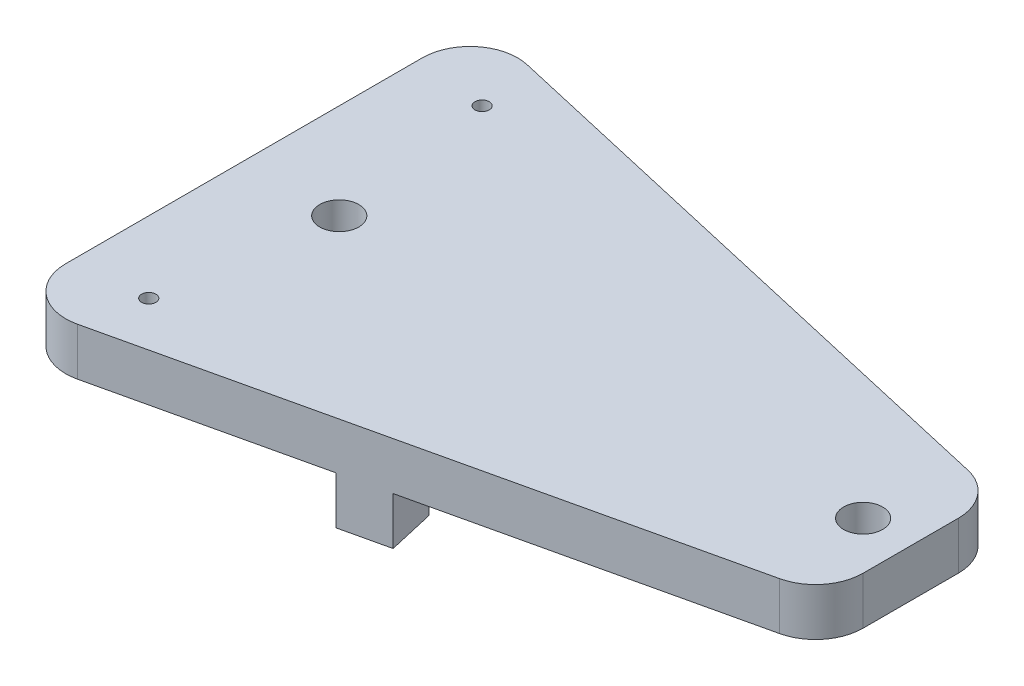
ISO-10303-21;
HEADER;
FILE_DESCRIPTION(('STEP AP214'),'2;1');
FILE_NAME('part.step','',(''),(''),'','','');
FILE_SCHEMA(('AUTOMOTIVE_DESIGN { 1 0 10303 214 1 1 1 1 }'));
ENDSEC;
DATA;
#1=APPLICATION_CONTEXT('core data for automotive mechanical design processes');
#2=APPLICATION_PROTOCOL_DEFINITION('international standard','automotive_design',2000,#1);
#3=PRODUCT_CONTEXT('',#1,'mechanical');
#4=PRODUCT('Part','Part','',(#3));
#5=PRODUCT_RELATED_PRODUCT_CATEGORY('part','',(#4));
#6=PRODUCT_DEFINITION_FORMATION('','',#4);
#7=PRODUCT_DEFINITION_CONTEXT('part definition',#1,'design');
#8=PRODUCT_DEFINITION('design','',#6,#7);
#9=PRODUCT_DEFINITION_SHAPE('','',#8);
#10=(LENGTH_UNIT() NAMED_UNIT(*) SI_UNIT(.MILLI.,.METRE.));
#11=(NAMED_UNIT(*) PLANE_ANGLE_UNIT() SI_UNIT($,.RADIAN.));
#12=(NAMED_UNIT(*) SI_UNIT($,.STERADIAN.) SOLID_ANGLE_UNIT());
#13=UNCERTAINTY_MEASURE_WITH_UNIT(LENGTH_MEASURE(1.E-05),#10,'distance_accuracy_value','');
#14=(GEOMETRIC_REPRESENTATION_CONTEXT(3) GLOBAL_UNCERTAINTY_ASSIGNED_CONTEXT((#13)) GLOBAL_UNIT_ASSIGNED_CONTEXT((#10,
#11,#12)) REPRESENTATION_CONTEXT('',''));
#15=CARTESIAN_POINT('',(0.,0.,0.));
#16=DIRECTION('',(0.,0.,1.));
#17=DIRECTION('',(1.,0.,0.));
#18=AXIS2_PLACEMENT_3D('',#15,#16,#17);
#19=CARTESIAN_POINT('',(27.0142215577712,0.,-10.));
#20=DIRECTION('',(0.,-1.,0.));
#21=DIRECTION('',(0.,0.,-1.));
#22=AXIS2_PLACEMENT_3D('',#19,#20,#21);
#23=PLANE('',#22);
#24=DIRECTION('',(0.,0.,1.));
#25=VECTOR('',#24,1.);
#26=CARTESIAN_POINT('',(-82.8857784422288,0.,29.9));
#27=LINE('',#26,#25);
#28=CARTESIAN_POINT('',(-82.8857784422288,0.,29.9));
#29=VERTEX_POINT('',#28);
#30=CARTESIAN_POINT('',(-82.8857784422288,0.,40.1));
#31=VERTEX_POINT('',#30);
#32=EDGE_CURVE('E264',#29,#31,#27,.T.);
#33=ORIENTED_EDGE('',*,*,#32,.F.);
#34=DIRECTION('',(1.,0.,0.));
#35=VECTOR('',#34,1.);
#36=CARTESIAN_POINT('',(-93.0857784422288,0.,29.9));
#37=LINE('',#36,#35);
#38=CARTESIAN_POINT('',(-93.0857784422288,0.,29.9));
#39=VERTEX_POINT('',#38);
#40=EDGE_CURVE('E254',#39,#29,#37,.T.);
#41=ORIENTED_EDGE('',*,*,#40,.F.);
#42=DIRECTION('',(0.,0.,-1.));
#43=VECTOR('',#42,1.);
#44=CARTESIAN_POINT('',(-93.0857784422288,0.,29.9));
#45=LINE('',#44,#43);
#46=CARTESIAN_POINT('',(-93.0857784422288,0.,40.1));
#47=VERTEX_POINT('',#46);
#48=EDGE_CURVE('E270',#47,#39,#45,.T.);
#49=ORIENTED_EDGE('',*,*,#48,.F.);
#50=DIRECTION('',(-1.,0.,0.));
#51=VECTOR('',#50,1.);
#52=CARTESIAN_POINT('',(-93.0857784422288,0.,40.1));
#53=LINE('',#52,#51);
#54=EDGE_CURVE('E266',#31,#47,#53,.T.);
#55=ORIENTED_EDGE('',*,*,#54,.F.);
#56=EDGE_LOOP('',(#33,#41,#49,#55));
#57=FACE_BOUND('',#56,.T.);
#58=DIRECTION('',(0.,0.,1.));
#59=VECTOR('',#58,1.);
#60=CARTESIAN_POINT('',(-82.8857784422288,0.,-40.1));
#61=LINE('',#60,#59);
#62=CARTESIAN_POINT('',(-82.8857784422288,0.,-40.1));
#63=VERTEX_POINT('',#62);
#64=CARTESIAN_POINT('',(-82.8857784422288,0.,-29.9));
#65=VERTEX_POINT('',#64);
#66=EDGE_CURVE('E249',#63,#65,#61,.T.);
#67=ORIENTED_EDGE('',*,*,#66,.F.);
#68=DIRECTION('',(1.,0.,0.));
#69=VECTOR('',#68,1.);
#70=CARTESIAN_POINT('',(-93.0857784422288,0.,-40.1));
#71=LINE('',#70,#69);
#72=CARTESIAN_POINT('',(-93.0857784422288,0.,-40.1));
#73=VERTEX_POINT('',#72);
#74=EDGE_CURVE('E288',#73,#63,#71,.T.);
#75=ORIENTED_EDGE('',*,*,#74,.F.);
#76=DIRECTION('',(0.,0.,-1.));
#77=VECTOR('',#76,1.);
#78=CARTESIAN_POINT('',(-93.0857784422288,0.,-40.1));
#79=LINE('',#78,#77);
#80=CARTESIAN_POINT('',(-93.0857784422288,0.,-29.9));
#81=VERTEX_POINT('',#80);
#82=EDGE_CURVE('E302',#81,#73,#79,.T.);
#83=ORIENTED_EDGE('',*,*,#82,.F.);
#84=DIRECTION('',(-1.,0.,0.));
#85=VECTOR('',#84,1.);
#86=CARTESIAN_POINT('',(-93.0857784422288,0.,-29.9));
#87=LINE('',#86,#85);
#88=EDGE_CURVE('E299',#65,#81,#87,.T.);
#89=ORIENTED_EDGE('',*,*,#88,.F.);
#90=EDGE_LOOP('',(#67,#75,#83,#89));
#91=FACE_BOUND('',#90,.T.);
#92=CARTESIAN_POINT('',(-82.9857784422288,0.,0.));
#93=DIRECTION('',(0.,1.,0.));
#94=DIRECTION('',(0.,0.,1.));
#95=AXIS2_PLACEMENT_3D('',#92,#93,#94);
#96=CIRCLE('',#95,4.1);
#97=CARTESIAN_POINT('',(-82.9857784422288,0.,4.1));
#98=VERTEX_POINT('',#97);
#99=EDGE_CURVE('E324',#98,#98,#96,.T.);
#100=ORIENTED_EDGE('',*,*,#99,.T.);
#101=EDGE_LOOP('',(#100));
#102=FACE_BOUND('',#101,.T.);
#103=CARTESIAN_POINT('',(27.0142215577712,0.,0.));
#104=DIRECTION('',(0.,1.,0.));
#105=DIRECTION('',(0.,0.,1.));
#106=AXIS2_PLACEMENT_3D('',#103,#104,#105);
#107=CIRCLE('',#106,4.1);
#108=CARTESIAN_POINT('',(27.0142215577712,0.,4.1));
#109=VERTEX_POINT('',#108);
#110=EDGE_CURVE('E320',#109,#109,#107,.T.);
#111=ORIENTED_EDGE('',*,*,#110,.T.);
#112=EDGE_LOOP('',(#111));
#113=FACE_BOUND('',#112,.T.);
#114=DIRECTION('',(-0.974813943574362,0.,-0.223019674945958));
#115=VECTOR('',#114,1.);
#116=CARTESIAN_POINT('',(-90.7555816927692,0.,-47.2019537455647));
#117=LINE('',#116,#115);
#118=CARTESIAN_POINT('',(-46.5666702904307,0.,-37.0923356772902));
#119=VERTEX_POINT('',#118);
#120=CARTESIAN_POINT('',(-90.7555816927692,0.,-47.2019537455647));
#121=VERTEX_POINT('',#120);
#122=EDGE_CURVE('E354',#119,#121,#117,.T.);
#123=ORIENTED_EDGE('',*,*,#122,.F.);
#124=DIRECTION('',(0.223019674945958,0.,-0.974813943574362));
#125=VECTOR('',#124,1.);
#126=CARTESIAN_POINT('',(-48.7968670398903,0.,-27.3441962415466));
#127=LINE('',#126,#125);
#128=CARTESIAN_POINT('',(-48.7968670398903,0.,-27.3441962415466));
#129=VERTEX_POINT('',#128);
#130=EDGE_CURVE('E50',#129,#119,#127,.T.);
#131=ORIENTED_EDGE('',*,*,#130,.F.);
#132=DIRECTION('',(-0.974813943574362,0.,-0.223019674945958));
#133=VECTOR('',#132,1.);
#134=CARTESIAN_POINT('',(-39.0487276041467,0.,-25.113999492087));
#135=LINE('',#134,#133);
#136=CARTESIAN_POINT('',(-39.0487276041467,0.,-25.113999492087));
#137=VERTEX_POINT('',#136);
#138=EDGE_CURVE('E214',#137,#129,#135,.T.);
#139=ORIENTED_EDGE('',*,*,#138,.F.);
#140=DIRECTION('',(-0.223019674945957,0.,0.974813943574362));
#141=VECTOR('',#140,1.);
#142=CARTESIAN_POINT('',(-36.8185308546871,0.,-34.8621389278306));
#143=LINE('',#142,#141);
#144=CARTESIAN_POINT('',(-36.8185308546871,0.,-34.8621389278306));
#145=VERTEX_POINT('',#144);
#146=EDGE_CURVE('E470',#145,#137,#143,.T.);
#147=ORIENTED_EDGE('',*,*,#146,.F.);
#148=CARTESIAN_POINT('',(29.2444183072308,0.,-19.7481394357436));
#149=VERTEX_POINT('',#148);
#150=EDGE_CURVE('E355',#149,#145,#117,.T.);
#151=ORIENTED_EDGE('',*,*,#150,.F.);
#152=CARTESIAN_POINT('',(27.0142215577712,0.,-10.));
#153=DIRECTION('',(0.,1.,0.));
#154=DIRECTION('',(0.,0.,-1.));
#155=AXIS2_PLACEMENT_3D('',#152,#153,#154);
#156=CIRCLE('',#155,9.99999999999999);
#157=CARTESIAN_POINT('',(37.0142215577712,0.,-10.));
#158=VERTEX_POINT('',#157);
#159=EDGE_CURVE('E330',#158,#149,#156,.T.);
#160=ORIENTED_EDGE('',*,*,#159,.F.);
#161=DIRECTION('',(0.,0.,-1.));
#162=VECTOR('',#161,1.);
#163=CARTESIAN_POINT('',(37.0142215577712,0.,10.));
#164=LINE('',#163,#162);
#165=CARTESIAN_POINT('',(37.0142215577712,0.,10.));
#166=VERTEX_POINT('',#165);
#167=EDGE_CURVE('E337',#166,#158,#164,.T.);
#168=ORIENTED_EDGE('',*,*,#167,.F.);
#169=CARTESIAN_POINT('',(27.0142215577712,0.,10.));
#170=DIRECTION('',(0.,1.,0.));
#171=DIRECTION('',(0.,0.,1.));
#172=AXIS2_PLACEMENT_3D('',#169,#170,#171);
#173=CIRCLE('',#172,9.99999999999999);
#174=CARTESIAN_POINT('',(29.2444183072308,0.,19.7481394357436));
#175=VERTEX_POINT('',#174);
#176=EDGE_CURVE('E367',#175,#166,#173,.T.);
#177=ORIENTED_EDGE('',*,*,#176,.F.);
#178=DIRECTION('',(0.974813943574362,0.,-0.223019674945958));
#179=VECTOR('',#178,1.);
#180=CARTESIAN_POINT('',(-90.7555816927692,0.,47.2019537455647));
#181=LINE('',#180,#179);
#182=CARTESIAN_POINT('',(-36.8185308546871,0.,34.8621389278306));
#183=VERTEX_POINT('',#182);
#184=EDGE_CURVE('E363',#183,#175,#181,.T.);
#185=ORIENTED_EDGE('',*,*,#184,.F.);
#186=DIRECTION('',(0.223019674945959,0.,0.974813943574362));
#187=VECTOR('',#186,1.);
#188=CARTESIAN_POINT('',(-36.8185308546871,0.,34.8621389278306));
#189=LINE('',#188,#187);
#190=CARTESIAN_POINT('',(-39.0487276041467,0.,25.113999492087));
#191=VERTEX_POINT('',#190);
#192=EDGE_CURVE('E229',#191,#183,#189,.T.);
#193=ORIENTED_EDGE('',*,*,#192,.F.);
#194=DIRECTION('',(0.974813943574362,0.,-0.223019674945958));
#195=VECTOR('',#194,1.);
#196=CARTESIAN_POINT('',(-39.0487276041467,0.,25.113999492087));
#197=LINE('',#196,#195);
#198=CARTESIAN_POINT('',(-48.7968670398903,0.,27.3441962415466));
#199=VERTEX_POINT('',#198);
#200=EDGE_CURVE('E58',#199,#191,#197,.T.);
#201=ORIENTED_EDGE('',*,*,#200,.F.);
#202=DIRECTION('',(-0.223019674945957,0.,-0.974813943574362));
#203=VECTOR('',#202,1.);
#204=CARTESIAN_POINT('',(-48.7968670398903,0.,27.3441962415466));
#205=LINE('',#204,#203);
#206=CARTESIAN_POINT('',(-46.5666702904307,0.,37.0923356772902));
#207=VERTEX_POINT('',#206);
#208=EDGE_CURVE('E217',#207,#199,#205,.T.);
#209=ORIENTED_EDGE('',*,*,#208,.F.);
#210=CARTESIAN_POINT('',(-90.7555816927692,0.,47.2019537455647));
#211=VERTEX_POINT('',#210);
#212=EDGE_CURVE('E364',#211,#207,#181,.T.);
#213=ORIENTED_EDGE('',*,*,#212,.F.);
#214=CARTESIAN_POINT('',(-92.9857784422288,0.,37.453814309821));
#215=DIRECTION('',(0.,1.,0.));
#216=DIRECTION('',(0.,0.,-1.));
#217=AXIS2_PLACEMENT_3D('',#214,#215,#216);
#218=CIRCLE('',#217,10.);
#219=CARTESIAN_POINT('',(-102.985778442229,0.,37.453814309821));
#220=VERTEX_POINT('',#219);
#221=EDGE_CURVE('E361',#220,#211,#218,.T.);
#222=ORIENTED_EDGE('',*,*,#221,.F.);
#223=DIRECTION('',(0.,0.,1.));
#224=VECTOR('',#223,1.);
#225=CARTESIAN_POINT('',(-102.985778442229,0.,37.453814309821));
#226=LINE('',#225,#224);
#227=CARTESIAN_POINT('',(-102.985778442229,0.,-37.453814309821));
#228=VERTEX_POINT('',#227);
#229=EDGE_CURVE('E359',#228,#220,#226,.T.);
#230=ORIENTED_EDGE('',*,*,#229,.F.);
#231=CARTESIAN_POINT('',(-92.9857784422288,0.,-37.453814309821));
#232=DIRECTION('',(0.,1.,0.));
#233=DIRECTION('',(0.,0.,-1.));
#234=AXIS2_PLACEMENT_3D('',#231,#232,#233);
#235=CIRCLE('',#234,10.);
#236=EDGE_CURVE('E357',#121,#228,#235,.T.);
#237=ORIENTED_EDGE('',*,*,#236,.F.);
#238=EDGE_LOOP('',(#123,#131,#139,#147,#151,#160,#168,#177,#185,#193,#201,#209,#213,#222,#230,#237));
#239=FACE_BOUND('',#238,.T.);
#240=ADVANCED_FACE('F33',(#57,#91,#102,#113,#239),#23,.T.);
#241=CARTESIAN_POINT('',(27.0142215577712,10.,-10.));
#242=DIRECTION('',(0.,-1.,0.));
#243=DIRECTION('',(0.,0.,-1.));
#244=AXIS2_PLACEMENT_3D('',#241,#242,#243);
#245=PLANE('',#244);
#246=CARTESIAN_POINT('',(27.0142215577712,10.,-10.));
#247=DIRECTION('',(0.,1.,0.));
#248=DIRECTION('',(0.,0.,-1.));
#249=AXIS2_PLACEMENT_3D('',#246,#247,#248);
#250=CIRCLE('',#249,9.99999999999999);
#251=CARTESIAN_POINT('',(37.0142215577712,10.,-10.));
#252=VERTEX_POINT('',#251);
#253=CARTESIAN_POINT('',(29.2444183072308,10.,-19.7481394357436));
#254=VERTEX_POINT('',#253);
#255=EDGE_CURVE('E333',#252,#254,#250,.T.);
#256=ORIENTED_EDGE('',*,*,#255,.T.);
#257=DIRECTION('',(-0.974813943574362,0.,-0.223019674945958));
#258=VECTOR('',#257,1.);
#259=CARTESIAN_POINT('',(-90.7555816927692,10.,-47.2019537455647));
#260=LINE('',#259,#258);
#261=CARTESIAN_POINT('',(-90.7555816927692,10.,-47.2019537455647));
#262=VERTEX_POINT('',#261);
#263=EDGE_CURVE('E336',#254,#262,#260,.T.);
#264=ORIENTED_EDGE('',*,*,#263,.T.);
#265=CARTESIAN_POINT('',(-92.9857784422288,10.,-37.453814309821));
#266=DIRECTION('',(0.,1.,0.));
#267=DIRECTION('',(0.,0.,-1.));
#268=AXIS2_PLACEMENT_3D('',#265,#266,#267);
#269=CIRCLE('',#268,10.);
#270=CARTESIAN_POINT('',(-102.985778442229,10.,-37.453814309821));
#271=VERTEX_POINT('',#270);
#272=EDGE_CURVE('E339',#262,#271,#269,.T.);
#273=ORIENTED_EDGE('',*,*,#272,.T.);
#274=DIRECTION('',(0.,0.,1.));
#275=VECTOR('',#274,1.);
#276=CARTESIAN_POINT('',(-102.985778442229,10.,37.453814309821));
#277=LINE('',#276,#275);
#278=CARTESIAN_POINT('',(-102.985778442229,10.,37.453814309821));
#279=VERTEX_POINT('',#278);
#280=EDGE_CURVE('E341',#271,#279,#277,.T.);
#281=ORIENTED_EDGE('',*,*,#280,.T.);
#282=CARTESIAN_POINT('',(-92.9857784422288,10.,37.453814309821));
#283=DIRECTION('',(0.,1.,0.));
#284=DIRECTION('',(0.,0.,-1.));
#285=AXIS2_PLACEMENT_3D('',#282,#283,#284);
#286=CIRCLE('',#285,10.);
#287=CARTESIAN_POINT('',(-90.7555816927692,10.,47.2019537455647));
#288=VERTEX_POINT('',#287);
#289=EDGE_CURVE('E343',#279,#288,#286,.T.);
#290=ORIENTED_EDGE('',*,*,#289,.T.);
#291=DIRECTION('',(0.974813943574362,0.,-0.223019674945958));
#292=VECTOR('',#291,1.);
#293=CARTESIAN_POINT('',(-90.7555816927692,10.,47.2019537455647));
#294=LINE('',#293,#292);
#295=CARTESIAN_POINT('',(29.2444183072308,10.,19.7481394357436));
#296=VERTEX_POINT('',#295);
#297=EDGE_CURVE('E345',#288,#296,#294,.T.);
#298=ORIENTED_EDGE('',*,*,#297,.T.);
#299=CARTESIAN_POINT('',(27.0142215577712,10.,10.));
#300=DIRECTION('',(0.,1.,0.));
#301=DIRECTION('',(0.,0.,1.));
#302=AXIS2_PLACEMENT_3D('',#299,#300,#301);
#303=CIRCLE('',#302,9.99999999999999);
#304=CARTESIAN_POINT('',(37.0142215577712,10.,10.));
#305=VERTEX_POINT('',#304);
#306=EDGE_CURVE('E347',#296,#305,#303,.T.);
#307=ORIENTED_EDGE('',*,*,#306,.T.);
#308=DIRECTION('',(0.,0.,-1.));
#309=VECTOR('',#308,1.);
#310=CARTESIAN_POINT('',(37.0142215577712,10.,10.));
#311=LINE('',#310,#309);
#312=EDGE_CURVE('E349',#305,#252,#311,.T.);
#313=ORIENTED_EDGE('',*,*,#312,.T.);
#314=EDGE_LOOP('',(#256,#264,#273,#281,#290,#298,#307,#313));
#315=FACE_BOUND('',#314,.T.);
#316=CARTESIAN_POINT('',(-82.9857784422288,10.,0.));
#317=DIRECTION('',(0.,1.,0.));
#318=DIRECTION('',(0.,0.,1.));
#319=AXIS2_PLACEMENT_3D('',#316,#317,#318);
#320=CIRCLE('',#319,4.1);
#321=CARTESIAN_POINT('',(-82.9857784422288,10.,4.1));
#322=VERTEX_POINT('',#321);
#323=EDGE_CURVE('E327',#322,#322,#320,.T.);
#324=ORIENTED_EDGE('',*,*,#323,.F.);
#325=EDGE_LOOP('',(#324));
#326=FACE_BOUND('',#325,.T.);
#327=CARTESIAN_POINT('',(27.0142215577712,10.,0.));
#328=DIRECTION('',(0.,1.,0.));
#329=DIRECTION('',(0.,0.,1.));
#330=AXIS2_PLACEMENT_3D('',#327,#328,#329);
#331=CIRCLE('',#330,4.1);
#332=CARTESIAN_POINT('',(27.0142215577712,10.,4.1));
#333=VERTEX_POINT('',#332);
#334=EDGE_CURVE('E321',#333,#333,#331,.T.);
#335=ORIENTED_EDGE('',*,*,#334,.F.);
#336=EDGE_LOOP('',(#335));
#337=FACE_BOUND('',#336,.T.);
#338=CARTESIAN_POINT('',(-87.9857784422288,10.,35.));
#339=DIRECTION('',(0.,1.,0.));
#340=DIRECTION('',(0.,0.,1.));
#341=AXIS2_PLACEMENT_3D('',#338,#339,#340);
#342=CIRCLE('',#341,1.5);
#343=CARTESIAN_POINT('',(-87.9857784422288,10.,36.5));
#344=VERTEX_POINT('',#343);
#345=EDGE_CURVE('E317',#344,#344,#342,.T.);
#346=ORIENTED_EDGE('',*,*,#345,.F.);
#347=EDGE_LOOP('',(#346));
#348=FACE_BOUND('',#347,.T.);
#349=CARTESIAN_POINT('',(-87.9857784422288,10.,-35.));
#350=DIRECTION('',(0.,1.,0.));
#351=DIRECTION('',(0.,0.,1.));
#352=AXIS2_PLACEMENT_3D('',#349,#350,#351);
#353=CIRCLE('',#352,1.5);
#354=CARTESIAN_POINT('',(-87.9857784422288,10.,-33.5));
#355=VERTEX_POINT('',#354);
#356=EDGE_CURVE('E314',#355,#355,#353,.T.);
#357=ORIENTED_EDGE('',*,*,#356,.F.);
#358=EDGE_LOOP('',(#357));
#359=FACE_BOUND('',#358,.T.);
#360=ADVANCED_FACE('F405',(#315,#326,#337,#348,#359),#245,.F.);
#361=CARTESIAN_POINT('',(27.0142215577712,10.,-10.));
#362=DIRECTION('',(0.,-1.,0.));
#363=DIRECTION('',(0.,0.,-1.));
#364=AXIS2_PLACEMENT_3D('',#361,#362,#363);
#365=CYLINDRICAL_SURFACE('',#364,9.99999999999999);
#366=ORIENTED_EDGE('',*,*,#159,.T.);
#367=DIRECTION('',(0.,-1.,0.));
#368=VECTOR('',#367,1.);
#369=CARTESIAN_POINT('',(29.2444183072308,10.,-19.7481394357436));
#370=LINE('',#369,#368);
#371=EDGE_CURVE('E11',#254,#149,#370,.T.);
#372=ORIENTED_EDGE('',*,*,#371,.F.);
#373=ORIENTED_EDGE('',*,*,#255,.F.);
#374=DIRECTION('',(0.,-1.,0.));
#375=VECTOR('',#374,1.);
#376=CARTESIAN_POINT('',(37.0142215577712,10.,-10.));
#377=LINE('',#376,#375);
#378=EDGE_CURVE('E351',#252,#158,#377,.T.);
#379=ORIENTED_EDGE('',*,*,#378,.T.);
#380=EDGE_LOOP('',(#366,#372,#373,#379));
#381=FACE_BOUND('',#380,.T.);
#382=ADVANCED_FACE('F35',(#381),#365,.T.);
#383=CARTESIAN_POINT('',(-90.7555816927692,10.,-47.2019537455647));
#384=DIRECTION('',(-0.223019674945958,0.,0.974813943574362));
#385=DIRECTION('',(0.974813943574362,0.,0.223019674945958));
#386=AXIS2_PLACEMENT_3D('',#383,#384,#385);
#387=PLANE('',#386);
#388=ORIENTED_EDGE('',*,*,#150,.T.);
#389=DIRECTION('',(0.,1.,0.));
#390=VECTOR('',#389,1.);
#391=CARTESIAN_POINT('',(-36.8185308546871,-10.,-34.8621389278306));
#392=LINE('',#391,#390);
#393=CARTESIAN_POINT('',(-36.8185308546871,-10.,-34.8621389278306));
#394=VERTEX_POINT('',#393);
#395=EDGE_CURVE('E203',#394,#145,#392,.T.);
#396=ORIENTED_EDGE('',*,*,#395,.F.);
#397=DIRECTION('',(0.974813943574362,0.,0.223019674945958));
#398=VECTOR('',#397,1.);
#399=CARTESIAN_POINT('',(-46.5666702904307,-10.,-37.0923356772902));
#400=LINE('',#399,#398);
#401=CARTESIAN_POINT('',(-46.5666702904307,-10.,-37.0923356772902));
#402=VERTEX_POINT('',#401);
#403=EDGE_CURVE('E197',#402,#394,#400,.T.);
#404=ORIENTED_EDGE('',*,*,#403,.F.);
#405=DIRECTION('',(0.,1.,0.));
#406=VECTOR('',#405,1.);
#407=CARTESIAN_POINT('',(-46.5666702904307,-10.,-37.0923356772902));
#408=LINE('',#407,#406);
#409=EDGE_CURVE('E201',#402,#119,#408,.T.);
#410=ORIENTED_EDGE('',*,*,#409,.T.);
#411=ORIENTED_EDGE('',*,*,#122,.T.);
#412=DIRECTION('',(0.,-1.,0.));
#413=VECTOR('',#412,1.);
#414=CARTESIAN_POINT('',(-90.7555816927692,10.,-47.2019537455647));
#415=LINE('',#414,#413);
#416=EDGE_CURVE('E42',#262,#121,#415,.T.);
#417=ORIENTED_EDGE('',*,*,#416,.F.);
#418=ORIENTED_EDGE('',*,*,#263,.F.);
#419=ORIENTED_EDGE('',*,*,#371,.T.);
#420=EDGE_LOOP('',(#388,#396,#404,#410,#411,#417,#418,#419));
#421=FACE_BOUND('',#420,.T.);
#422=ADVANCED_FACE('F200',(#421),#387,.F.);
#423=CARTESIAN_POINT('',(-92.9857784422288,10.,-37.453814309821));
#424=DIRECTION('',(0.,-1.,0.));
#425=DIRECTION('',(0.,0.,-1.));
#426=AXIS2_PLACEMENT_3D('',#423,#424,#425);
#427=CYLINDRICAL_SURFACE('',#426,10.);
#428=ORIENTED_EDGE('',*,*,#236,.T.);
#429=DIRECTION('',(0.,-1.,0.));
#430=VECTOR('',#429,1.);
#431=CARTESIAN_POINT('',(-102.985778442229,10.,-37.453814309821));
#432=LINE('',#431,#430);
#433=EDGE_CURVE('E384',#271,#228,#432,.T.);
#434=ORIENTED_EDGE('',*,*,#433,.F.);
#435=ORIENTED_EDGE('',*,*,#272,.F.);
#436=ORIENTED_EDGE('',*,*,#416,.T.);
#437=EDGE_LOOP('',(#428,#434,#435,#436));
#438=FACE_BOUND('',#437,.T.);
#439=ADVANCED_FACE('F451',(#438),#427,.T.);
#440=CARTESIAN_POINT('',(-102.985778442229,10.,37.453814309821));
#441=DIRECTION('',(1.,0.,0.));
#442=DIRECTION('',(0.,0.,-1.));
#443=AXIS2_PLACEMENT_3D('',#440,#441,#442);
#444=PLANE('',#443);
#445=ORIENTED_EDGE('',*,*,#229,.T.);
#446=DIRECTION('',(0.,-1.,0.));
#447=VECTOR('',#446,1.);
#448=CARTESIAN_POINT('',(-102.985778442229,10.,37.453814309821));
#449=LINE('',#448,#447);
#450=EDGE_CURVE('E381',#279,#220,#449,.T.);
#451=ORIENTED_EDGE('',*,*,#450,.F.);
#452=ORIENTED_EDGE('',*,*,#280,.F.);
#453=ORIENTED_EDGE('',*,*,#433,.T.);
#454=EDGE_LOOP('',(#445,#451,#452,#453));
#455=FACE_BOUND('',#454,.T.);
#456=ADVANCED_FACE('F447',(#455),#444,.F.);
#457=CARTESIAN_POINT('',(-92.9857784422288,10.,37.453814309821));
#458=DIRECTION('',(0.,-1.,0.));
#459=DIRECTION('',(0.,0.,-1.));
#460=AXIS2_PLACEMENT_3D('',#457,#458,#459);
#461=CYLINDRICAL_SURFACE('',#460,10.);
#462=ORIENTED_EDGE('',*,*,#221,.T.);
#463=DIRECTION('',(0.,-1.,0.));
#464=VECTOR('',#463,1.);
#465=CARTESIAN_POINT('',(-90.7555816927692,10.,47.2019537455647));
#466=LINE('',#465,#464);
#467=EDGE_CURVE('E378',#288,#211,#466,.T.);
#468=ORIENTED_EDGE('',*,*,#467,.F.);
#469=ORIENTED_EDGE('',*,*,#289,.F.);
#470=ORIENTED_EDGE('',*,*,#450,.T.);
#471=EDGE_LOOP('',(#462,#468,#469,#470));
#472=FACE_BOUND('',#471,.T.);
#473=ADVANCED_FACE('F443',(#472),#461,.T.);
#474=CARTESIAN_POINT('',(-90.7555816927692,10.,47.2019537455647));
#475=DIRECTION('',(-0.223019674945958,0.,-0.974813943574362));
#476=DIRECTION('',(-0.974813943574362,0.,0.223019674945958));
#477=AXIS2_PLACEMENT_3D('',#474,#475,#476);
#478=PLANE('',#477);
#479=ORIENTED_EDGE('',*,*,#212,.T.);
#480=DIRECTION('',(0.,1.,0.));
#481=VECTOR('',#480,1.);
#482=CARTESIAN_POINT('',(-46.5666702904307,-10.,37.0923356772902));
#483=LINE('',#482,#481);
#484=CARTESIAN_POINT('',(-46.5666702904307,-10.,37.0923356772902));
#485=VERTEX_POINT('',#484);
#486=EDGE_CURVE('E234',#485,#207,#483,.T.);
#487=ORIENTED_EDGE('',*,*,#486,.F.);
#488=DIRECTION('',(-0.974813943574362,0.,0.223019674945957));
#489=VECTOR('',#488,1.);
#490=CARTESIAN_POINT('',(-46.5666702904307,-10.,37.0923356772902));
#491=LINE('',#490,#489);
#492=CARTESIAN_POINT('',(-36.8185308546871,-10.,34.8621389278306));
#493=VERTEX_POINT('',#492);
#494=EDGE_CURVE('E233',#493,#485,#491,.T.);
#495=ORIENTED_EDGE('',*,*,#494,.F.);
#496=DIRECTION('',(0.,1.,0.));
#497=VECTOR('',#496,1.);
#498=CARTESIAN_POINT('',(-36.8185308546871,-10.,34.8621389278306));
#499=LINE('',#498,#497);
#500=EDGE_CURVE('E241',#493,#183,#499,.T.);
#501=ORIENTED_EDGE('',*,*,#500,.T.);
#502=ORIENTED_EDGE('',*,*,#184,.T.);
#503=DIRECTION('',(0.,-1.,0.));
#504=VECTOR('',#503,1.);
#505=CARTESIAN_POINT('',(29.2444183072308,10.,19.7481394357436));
#506=LINE('',#505,#504);
#507=EDGE_CURVE('E375',#296,#175,#506,.T.);
#508=ORIENTED_EDGE('',*,*,#507,.F.);
#509=ORIENTED_EDGE('',*,*,#297,.F.);
#510=ORIENTED_EDGE('',*,*,#467,.T.);
#511=EDGE_LOOP('',(#479,#487,#495,#501,#502,#508,#509,#510));
#512=FACE_BOUND('',#511,.T.);
#513=ADVANCED_FACE('F439',(#512),#478,.F.);
#514=CARTESIAN_POINT('',(27.0142215577712,10.,10.));
#515=DIRECTION('',(0.,-1.,0.));
#516=DIRECTION('',(0.,0.,-1.));
#517=AXIS2_PLACEMENT_3D('',#514,#515,#516);
#518=CYLINDRICAL_SURFACE('',#517,9.99999999999999);
#519=ORIENTED_EDGE('',*,*,#176,.T.);
#520=DIRECTION('',(0.,-1.,0.));
#521=VECTOR('',#520,1.);
#522=CARTESIAN_POINT('',(37.0142215577712,10.,10.));
#523=LINE('',#522,#521);
#524=EDGE_CURVE('E372',#305,#166,#523,.T.);
#525=ORIENTED_EDGE('',*,*,#524,.F.);
#526=ORIENTED_EDGE('',*,*,#306,.F.);
#527=ORIENTED_EDGE('',*,*,#507,.T.);
#528=EDGE_LOOP('',(#519,#525,#526,#527));
#529=FACE_BOUND('',#528,.T.);
#530=ADVANCED_FACE('F435',(#529),#518,.T.);
#531=CARTESIAN_POINT('',(37.0142215577712,10.,10.));
#532=DIRECTION('',(-1.,0.,0.));
#533=DIRECTION('',(0.,0.,1.));
#534=AXIS2_PLACEMENT_3D('',#531,#532,#533);
#535=PLANE('',#534);
#536=ORIENTED_EDGE('',*,*,#167,.T.);
#537=ORIENTED_EDGE('',*,*,#378,.F.);
#538=ORIENTED_EDGE('',*,*,#312,.F.);
#539=ORIENTED_EDGE('',*,*,#524,.T.);
#540=EDGE_LOOP('',(#536,#537,#538,#539));
#541=FACE_BOUND('',#540,.T.);
#542=ADVANCED_FACE('F431',(#541),#535,.F.);
#543=CARTESIAN_POINT('',(-82.9857784422288,10.,0.));
#544=DIRECTION('',(0.,-1.,0.));
#545=DIRECTION('',(0.,0.,-1.));
#546=AXIS2_PLACEMENT_3D('',#543,#544,#545);
#547=CYLINDRICAL_SURFACE('',#546,4.1);
#548=ORIENTED_EDGE('',*,*,#323,.T.);
#549=EDGE_LOOP('',(#548));
#550=FACE_BOUND('',#549,.T.);
#551=ORIENTED_EDGE('',*,*,#99,.F.);
#552=EDGE_LOOP('',(#551));
#553=FACE_BOUND('',#552,.T.);
#554=ADVANCED_FACE('F434',(#550,#553),#547,.F.);
#555=CARTESIAN_POINT('',(27.0142215577712,10.,0.));
#556=DIRECTION('',(0.,-1.,0.));
#557=DIRECTION('',(0.,0.,-1.));
#558=AXIS2_PLACEMENT_3D('',#555,#556,#557);
#559=CYLINDRICAL_SURFACE('',#558,4.1);
#560=ORIENTED_EDGE('',*,*,#334,.T.);
#561=EDGE_LOOP('',(#560));
#562=FACE_BOUND('',#561,.T.);
#563=ORIENTED_EDGE('',*,*,#110,.F.);
#564=EDGE_LOOP('',(#563));
#565=FACE_BOUND('',#564,.T.);
#566=ADVANCED_FACE('F401',(#562,#565),#559,.F.);
#567=CARTESIAN_POINT('',(-87.9857784422288,10.,35.));
#568=DIRECTION('',(0.,-1.,0.));
#569=DIRECTION('',(0.,0.,-1.));
#570=AXIS2_PLACEMENT_3D('',#567,#568,#569);
#571=CYLINDRICAL_SURFACE('',#570,1.5);
#572=CARTESIAN_POINT('',(-87.9857784422288,5.,35.));
#573=DIRECTION('',(0.,1.,0.));
#574=DIRECTION('',(0.,0.,1.));
#575=AXIS2_PLACEMENT_3D('',#572,#573,#574);
#576=CIRCLE('',#575,1.5);
#577=CARTESIAN_POINT('',(-87.9857784422288,5.,36.5));
#578=VERTEX_POINT('',#577);
#579=EDGE_CURVE('E37',#578,#578,#576,.T.);
#580=ORIENTED_EDGE('',*,*,#579,.F.);
#581=EDGE_LOOP('',(#580));
#582=FACE_BOUND('',#581,.T.);
#583=ORIENTED_EDGE('',*,*,#345,.T.);
#584=EDGE_LOOP('',(#583));
#585=FACE_BOUND('',#584,.T.);
#586=ADVANCED_FACE('F397',(#582,#585),#571,.F.);
#587=CARTESIAN_POINT('',(-87.9857784422288,10.,-35.));
#588=DIRECTION('',(0.,-1.,0.));
#589=DIRECTION('',(0.,0.,-1.));
#590=AXIS2_PLACEMENT_3D('',#587,#588,#589);
#591=CYLINDRICAL_SURFACE('',#590,1.5);
#592=CARTESIAN_POINT('',(-87.9857784422288,5.,-35.));
#593=DIRECTION('',(0.,1.,0.));
#594=DIRECTION('',(0.,0.,1.));
#595=AXIS2_PLACEMENT_3D('',#592,#593,#594);
#596=CIRCLE('',#595,1.5);
#597=CARTESIAN_POINT('',(-87.9857784422288,5.,-33.5));
#598=VERTEX_POINT('',#597);
#599=EDGE_CURVE('E277',#598,#598,#596,.T.);
#600=ORIENTED_EDGE('',*,*,#599,.F.);
#601=EDGE_LOOP('',(#600));
#602=FACE_BOUND('',#601,.T.);
#603=ORIENTED_EDGE('',*,*,#356,.T.);
#604=EDGE_LOOP('',(#603));
#605=FACE_BOUND('',#604,.T.);
#606=ADVANCED_FACE('F400',(#602,#605),#591,.F.);
#607=CARTESIAN_POINT('',(-82.8857784422288,5.,-40.1));
#608=DIRECTION('',(1.,0.,0.));
#609=DIRECTION('',(0.,0.,-1.));
#610=AXIS2_PLACEMENT_3D('',#607,#608,#609);
#611=PLANE('',#610);
#612=ORIENTED_EDGE('',*,*,#66,.T.);
#613=DIRECTION('',(0.,-1.,0.));
#614=VECTOR('',#613,1.);
#615=CARTESIAN_POINT('',(-82.8857784422288,5.,-29.9));
#616=LINE('',#615,#614);
#617=CARTESIAN_POINT('',(-82.8857784422288,5.,-29.9));
#618=VERTEX_POINT('',#617);
#619=EDGE_CURVE('E297',#618,#65,#616,.T.);
#620=ORIENTED_EDGE('',*,*,#619,.F.);
#621=DIRECTION('',(0.,0.,1.));
#622=VECTOR('',#621,1.);
#623=CARTESIAN_POINT('',(-82.8857784422288,5.,-40.1));
#624=LINE('',#623,#622);
#625=CARTESIAN_POINT('',(-82.8857784422288,5.,-40.1));
#626=VERTEX_POINT('',#625);
#627=EDGE_CURVE('E284',#626,#618,#624,.T.);
#628=ORIENTED_EDGE('',*,*,#627,.F.);
#629=DIRECTION('',(0.,-1.,0.));
#630=VECTOR('',#629,1.);
#631=CARTESIAN_POINT('',(-82.8857784422288,5.,-40.1));
#632=LINE('',#631,#630);
#633=EDGE_CURVE('E267',#626,#63,#632,.T.);
#634=ORIENTED_EDGE('',*,*,#633,.T.);
#635=EDGE_LOOP('',(#612,#620,#628,#634));
#636=FACE_BOUND('',#635,.T.);
#637=ADVANCED_FACE('F413',(#636),#611,.F.);
#638=CARTESIAN_POINT('',(-93.0857784422288,5.,-40.1));
#639=DIRECTION('',(0.,0.,-1.));
#640=DIRECTION('',(-1.,0.,0.));
#641=AXIS2_PLACEMENT_3D('',#638,#639,#640);
#642=PLANE('',#641);
#643=ORIENTED_EDGE('',*,*,#74,.T.);
#644=ORIENTED_EDGE('',*,*,#633,.F.);
#645=DIRECTION('',(1.,0.,0.));
#646=VECTOR('',#645,1.);
#647=CARTESIAN_POINT('',(-93.0857784422288,5.,-40.1));
#648=LINE('',#647,#646);
#649=CARTESIAN_POINT('',(-93.0857784422288,5.,-40.1));
#650=VERTEX_POINT('',#649);
#651=EDGE_CURVE('E294',#650,#626,#648,.T.);
#652=ORIENTED_EDGE('',*,*,#651,.F.);
#653=DIRECTION('',(0.,-1.,0.));
#654=VECTOR('',#653,1.);
#655=CARTESIAN_POINT('',(-93.0857784422288,5.,-40.1));
#656=LINE('',#655,#654);
#657=EDGE_CURVE('E308',#650,#73,#656,.T.);
#658=ORIENTED_EDGE('',*,*,#657,.T.);
#659=EDGE_LOOP('',(#643,#644,#652,#658));
#660=FACE_BOUND('',#659,.T.);
#661=ADVANCED_FACE('F419',(#660),#642,.F.);
#662=CARTESIAN_POINT('',(-93.0857784422288,5.,-40.1));
#663=DIRECTION('',(-1.,0.,0.));
#664=DIRECTION('',(0.,0.,1.));
#665=AXIS2_PLACEMENT_3D('',#662,#663,#664);
#666=PLANE('',#665);
#667=ORIENTED_EDGE('',*,*,#82,.T.);
#668=ORIENTED_EDGE('',*,*,#657,.F.);
#669=DIRECTION('',(0.,0.,-1.));
#670=VECTOR('',#669,1.);
#671=CARTESIAN_POINT('',(-93.0857784422288,5.,-40.1));
#672=LINE('',#671,#670);
#673=CARTESIAN_POINT('',(-93.0857784422288,5.,-29.9));
#674=VERTEX_POINT('',#673);
#675=EDGE_CURVE('E291',#674,#650,#672,.T.);
#676=ORIENTED_EDGE('',*,*,#675,.F.);
#677=DIRECTION('',(0.,-1.,0.));
#678=VECTOR('',#677,1.);
#679=CARTESIAN_POINT('',(-93.0857784422288,5.,-29.9));
#680=LINE('',#679,#678);
#681=EDGE_CURVE('E310',#674,#81,#680,.T.);
#682=ORIENTED_EDGE('',*,*,#681,.T.);
#683=EDGE_LOOP('',(#667,#668,#676,#682));
#684=FACE_BOUND('',#683,.T.);
#685=ADVANCED_FACE('F558',(#684),#666,.F.);
#686=CARTESIAN_POINT('',(-93.0857784422288,5.,-29.9));
#687=DIRECTION('',(0.,0.,1.));
#688=DIRECTION('',(1.,0.,0.));
#689=AXIS2_PLACEMENT_3D('',#686,#687,#688);
#690=PLANE('',#689);
#691=ORIENTED_EDGE('',*,*,#88,.T.);
#692=ORIENTED_EDGE('',*,*,#681,.F.);
#693=DIRECTION('',(-1.,0.,0.));
#694=VECTOR('',#693,1.);
#695=CARTESIAN_POINT('',(-93.0857784422288,5.,-29.9));
#696=LINE('',#695,#694);
#697=EDGE_CURVE('E287',#618,#674,#696,.T.);
#698=ORIENTED_EDGE('',*,*,#697,.F.);
#699=ORIENTED_EDGE('',*,*,#619,.T.);
#700=EDGE_LOOP('',(#691,#692,#698,#699));
#701=FACE_BOUND('',#700,.T.);
#702=ADVANCED_FACE('F555',(#701),#690,.F.);
#703=CARTESIAN_POINT('',(0.,5.,0.));
#704=DIRECTION('',(0.,1.,0.));
#705=DIRECTION('',(0.,0.,1.));
#706=AXIS2_PLACEMENT_3D('',#703,#704,#705);
#707=PLANE('',#706);
#708=ORIENTED_EDGE('',*,*,#599,.T.);
#709=EDGE_LOOP('',(#708));
#710=FACE_BOUND('',#709,.T.);
#711=ORIENTED_EDGE('',*,*,#627,.T.);
#712=ORIENTED_EDGE('',*,*,#697,.T.);
#713=ORIENTED_EDGE('',*,*,#675,.T.);
#714=ORIENTED_EDGE('',*,*,#651,.T.);
#715=EDGE_LOOP('',(#711,#712,#713,#714));
#716=FACE_BOUND('',#715,.T.);
#717=ADVANCED_FACE('F551',(#710,#716),#707,.F.);
#718=CARTESIAN_POINT('',(-82.8857784422288,5.,29.9));
#719=DIRECTION('',(1.,0.,0.));
#720=DIRECTION('',(0.,0.,-1.));
#721=AXIS2_PLACEMENT_3D('',#718,#719,#720);
#722=PLANE('',#721);
#723=ORIENTED_EDGE('',*,*,#32,.T.);
#724=DIRECTION('',(0.,-1.,0.));
#725=VECTOR('',#724,1.);
#726=CARTESIAN_POINT('',(-82.8857784422288,5.,40.1));
#727=LINE('',#726,#725);
#728=CARTESIAN_POINT('',(-82.8857784422288,5.,40.1));
#729=VERTEX_POINT('',#728);
#730=EDGE_CURVE('E263',#729,#31,#727,.T.);
#731=ORIENTED_EDGE('',*,*,#730,.F.);
#732=DIRECTION('',(0.,0.,1.));
#733=VECTOR('',#732,1.);
#734=CARTESIAN_POINT('',(-82.8857784422288,5.,29.9));
#735=LINE('',#734,#733);
#736=CARTESIAN_POINT('',(-82.8857784422288,5.,29.9));
#737=VERTEX_POINT('',#736);
#738=EDGE_CURVE('E250',#737,#729,#735,.T.);
#739=ORIENTED_EDGE('',*,*,#738,.F.);
#740=DIRECTION('',(0.,-1.,0.));
#741=VECTOR('',#740,1.);
#742=CARTESIAN_POINT('',(-82.8857784422288,5.,29.9));
#743=LINE('',#742,#741);
#744=EDGE_CURVE('E275',#737,#29,#743,.T.);
#745=ORIENTED_EDGE('',*,*,#744,.T.);
#746=EDGE_LOOP('',(#723,#731,#739,#745));
#747=FACE_BOUND('',#746,.T.);
#748=ADVANCED_FACE('F541',(#747),#722,.F.);
#749=CARTESIAN_POINT('',(-93.0857784422288,5.,29.9));
#750=DIRECTION('',(0.,0.,-1.));
#751=DIRECTION('',(-1.,0.,0.));
#752=AXIS2_PLACEMENT_3D('',#749,#750,#751);
#753=PLANE('',#752);
#754=ORIENTED_EDGE('',*,*,#40,.T.);
#755=ORIENTED_EDGE('',*,*,#744,.F.);
#756=DIRECTION('',(1.,0.,0.));
#757=VECTOR('',#756,1.);
#758=CARTESIAN_POINT('',(-93.0857784422288,5.,29.9));
#759=LINE('',#758,#757);
#760=CARTESIAN_POINT('',(-93.0857784422288,5.,29.9));
#761=VERTEX_POINT('',#760);
#762=EDGE_CURVE('E260',#761,#737,#759,.T.);
#763=ORIENTED_EDGE('',*,*,#762,.F.);
#764=DIRECTION('',(0.,-1.,0.));
#765=VECTOR('',#764,1.);
#766=CARTESIAN_POINT('',(-93.0857784422288,5.,29.9));
#767=LINE('',#766,#765);
#768=EDGE_CURVE('E278',#761,#39,#767,.T.);
#769=ORIENTED_EDGE('',*,*,#768,.T.);
#770=EDGE_LOOP('',(#754,#755,#763,#769));
#771=FACE_BOUND('',#770,.T.);
#772=ADVANCED_FACE('F537',(#771),#753,.F.);
#773=CARTESIAN_POINT('',(-93.0857784422288,5.,29.9));
#774=DIRECTION('',(-1.,0.,0.));
#775=DIRECTION('',(0.,0.,1.));
#776=AXIS2_PLACEMENT_3D('',#773,#774,#775);
#777=PLANE('',#776);
#778=ORIENTED_EDGE('',*,*,#48,.T.);
#779=ORIENTED_EDGE('',*,*,#768,.F.);
#780=DIRECTION('',(0.,0.,-1.));
#781=VECTOR('',#780,1.);
#782=CARTESIAN_POINT('',(-93.0857784422288,5.,29.9));
#783=LINE('',#782,#781);
#784=CARTESIAN_POINT('',(-93.0857784422288,5.,40.1));
#785=VERTEX_POINT('',#784);
#786=EDGE_CURVE('E257',#785,#761,#783,.T.);
#787=ORIENTED_EDGE('',*,*,#786,.F.);
#788=DIRECTION('',(0.,-1.,0.));
#789=VECTOR('',#788,1.);
#790=CARTESIAN_POINT('',(-93.0857784422288,5.,40.1));
#791=LINE('',#790,#789);
#792=EDGE_CURVE('E280',#785,#47,#791,.T.);
#793=ORIENTED_EDGE('',*,*,#792,.T.);
#794=EDGE_LOOP('',(#778,#779,#787,#793));
#795=FACE_BOUND('',#794,.T.);
#796=ADVANCED_FACE('F540',(#795),#777,.F.);
#797=CARTESIAN_POINT('',(-93.0857784422288,5.,40.1));
#798=DIRECTION('',(0.,0.,1.));
#799=DIRECTION('',(1.,0.,0.));
#800=AXIS2_PLACEMENT_3D('',#797,#798,#799);
#801=PLANE('',#800);
#802=ORIENTED_EDGE('',*,*,#54,.T.);
#803=ORIENTED_EDGE('',*,*,#792,.F.);
#804=DIRECTION('',(-1.,0.,0.));
#805=VECTOR('',#804,1.);
#806=CARTESIAN_POINT('',(-93.0857784422288,5.,40.1));
#807=LINE('',#806,#805);
#808=EDGE_CURVE('E253',#729,#785,#807,.T.);
#809=ORIENTED_EDGE('',*,*,#808,.F.);
#810=ORIENTED_EDGE('',*,*,#730,.T.);
#811=EDGE_LOOP('',(#802,#803,#809,#810));
#812=FACE_BOUND('',#811,.T.);
#813=ADVANCED_FACE('F536',(#812),#801,.F.);
#814=CARTESIAN_POINT('',(0.,5.,0.));
#815=DIRECTION('',(0.,1.,0.));
#816=DIRECTION('',(0.,0.,1.));
#817=AXIS2_PLACEMENT_3D('',#814,#815,#816);
#818=PLANE('',#817);
#819=ORIENTED_EDGE('',*,*,#579,.T.);
#820=EDGE_LOOP('',(#819));
#821=FACE_BOUND('',#820,.T.);
#822=ORIENTED_EDGE('',*,*,#738,.T.);
#823=ORIENTED_EDGE('',*,*,#808,.T.);
#824=ORIENTED_EDGE('',*,*,#786,.T.);
#825=ORIENTED_EDGE('',*,*,#762,.T.);
#826=EDGE_LOOP('',(#822,#823,#824,#825));
#827=FACE_BOUND('',#826,.T.);
#828=ADVANCED_FACE('F394',(#821,#827),#818,.F.);
#829=CARTESIAN_POINT('',(-48.7968670398903,-10.,27.3441962415466));
#830=DIRECTION('',(0.974813943574362,0.,-0.223019674945957));
#831=DIRECTION('',(-0.223019674945957,0.,-0.974813943574362));
#832=AXIS2_PLACEMENT_3D('',#829,#830,#831);
#833=PLANE('',#832);
#834=ORIENTED_EDGE('',*,*,#208,.T.);
#835=DIRECTION('',(0.,1.,0.));
#836=VECTOR('',#835,1.);
#837=CARTESIAN_POINT('',(-48.7968670398903,-10.,27.3441962415466));
#838=LINE('',#837,#836);
#839=CARTESIAN_POINT('',(-48.7968670398903,-10.,27.3441962415466));
#840=VERTEX_POINT('',#839);
#841=EDGE_CURVE('E247',#840,#199,#838,.T.);
#842=ORIENTED_EDGE('',*,*,#841,.F.);
#843=DIRECTION('',(-0.223019674945957,0.,-0.974813943574362));
#844=VECTOR('',#843,1.);
#845=CARTESIAN_POINT('',(-48.7968670398903,-10.,27.3441962415466));
#846=LINE('',#845,#844);
#847=EDGE_CURVE('E225',#485,#840,#846,.T.);
#848=ORIENTED_EDGE('',*,*,#847,.F.);
#849=ORIENTED_EDGE('',*,*,#486,.T.);
#850=EDGE_LOOP('',(#834,#842,#848,#849));
#851=FACE_BOUND('',#850,.T.);
#852=ADVANCED_FACE('F492',(#851),#833,.F.);
#853=CARTESIAN_POINT('',(-39.0487276041467,-10.,25.113999492087));
#854=DIRECTION('',(0.223019674945958,0.,0.974813943574362));
#855=DIRECTION('',(0.974813943574362,0.,-0.223019674945958));
#856=AXIS2_PLACEMENT_3D('',#853,#854,#855);
#857=PLANE('',#856);
#858=ORIENTED_EDGE('',*,*,#200,.T.);
#859=DIRECTION('',(0.,1.,0.));
#860=VECTOR('',#859,1.);
#861=CARTESIAN_POINT('',(-39.0487276041467,-10.,25.113999492087));
#862=LINE('',#861,#860);
#863=CARTESIAN_POINT('',(-39.0487276041467,-10.,25.113999492087));
#864=VERTEX_POINT('',#863);
#865=EDGE_CURVE('E244',#864,#191,#862,.T.);
#866=ORIENTED_EDGE('',*,*,#865,.F.);
#867=DIRECTION('',(0.974813943574362,0.,-0.223019674945958));
#868=VECTOR('',#867,1.);
#869=CARTESIAN_POINT('',(-39.0487276041467,-10.,25.113999492087));
#870=LINE('',#869,#868);
#871=EDGE_CURVE('E228',#840,#864,#870,.T.);
#872=ORIENTED_EDGE('',*,*,#871,.F.);
#873=ORIENTED_EDGE('',*,*,#841,.T.);
#874=EDGE_LOOP('',(#858,#866,#872,#873));
#875=FACE_BOUND('',#874,.T.);
#876=ADVANCED_FACE('F490',(#875),#857,.F.);
#877=CARTESIAN_POINT('',(-36.8185308546871,-10.,34.8621389278306));
#878=DIRECTION('',(-0.974813943574362,0.,0.223019674945959));
#879=DIRECTION('',(0.223019674945959,0.,0.974813943574362));
#880=AXIS2_PLACEMENT_3D('',#877,#878,#879);
#881=PLANE('',#880);
#882=ORIENTED_EDGE('',*,*,#192,.T.);
#883=ORIENTED_EDGE('',*,*,#500,.F.);
#884=DIRECTION('',(0.223019674945959,0.,0.974813943574362));
#885=VECTOR('',#884,1.);
#886=CARTESIAN_POINT('',(-36.8185308546871,-10.,34.8621389278306));
#887=LINE('',#886,#885);
#888=EDGE_CURVE('E231',#864,#493,#887,.T.);
#889=ORIENTED_EDGE('',*,*,#888,.F.);
#890=ORIENTED_EDGE('',*,*,#865,.T.);
#891=EDGE_LOOP('',(#882,#883,#889,#890));
#892=FACE_BOUND('',#891,.T.);
#893=ADVANCED_FACE('F480',(#892),#881,.F.);
#894=CARTESIAN_POINT('',(0.,-10.,0.));
#895=DIRECTION('',(0.,1.,0.));
#896=DIRECTION('',(0.,0.,1.));
#897=AXIS2_PLACEMENT_3D('',#894,#895,#896);
#898=PLANE('',#897);
#899=ORIENTED_EDGE('',*,*,#847,.T.);
#900=ORIENTED_EDGE('',*,*,#871,.T.);
#901=ORIENTED_EDGE('',*,*,#888,.T.);
#902=ORIENTED_EDGE('',*,*,#494,.T.);
#903=EDGE_LOOP('',(#899,#900,#901,#902));
#904=FACE_BOUND('',#903,.T.);
#905=ADVANCED_FACE('F487',(#904),#898,.F.);
#906=CARTESIAN_POINT('',(-48.7968670398903,-10.,-27.3441962415466));
#907=DIRECTION('',(0.974813943574362,0.,0.223019674945958));
#908=DIRECTION('',(0.223019674945958,0.,-0.974813943574362));
#909=AXIS2_PLACEMENT_3D('',#906,#907,#908);
#910=PLANE('',#909);
#911=ORIENTED_EDGE('',*,*,#130,.T.);
#912=ORIENTED_EDGE('',*,*,#409,.F.);
#913=DIRECTION('',(0.223019674945958,0.,-0.974813943574362));
#914=VECTOR('',#913,1.);
#915=CARTESIAN_POINT('',(-48.7968670398903,-10.,-27.3441962415466));
#916=LINE('',#915,#914);
#917=CARTESIAN_POINT('',(-48.7968670398903,-10.,-27.3441962415466));
#918=VERTEX_POINT('',#917);
#919=EDGE_CURVE('E207',#918,#402,#916,.T.);
#920=ORIENTED_EDGE('',*,*,#919,.F.);
#921=DIRECTION('',(0.,1.,0.));
#922=VECTOR('',#921,1.);
#923=CARTESIAN_POINT('',(-48.7968670398903,-10.,-27.3441962415466));
#924=LINE('',#923,#922);
#925=EDGE_CURVE('E509',#918,#129,#924,.T.);
#926=ORIENTED_EDGE('',*,*,#925,.T.);
#927=EDGE_LOOP('',(#911,#912,#920,#926));
#928=FACE_BOUND('',#927,.T.);
#929=ADVANCED_FACE('F216',(#928),#910,.F.);
#930=CARTESIAN_POINT('',(-36.8185308546871,-10.,-34.8621389278306));
#931=DIRECTION('',(-0.974813943574362,0.,-0.223019674945957));
#932=DIRECTION('',(-0.223019674945957,0.,0.974813943574362));
#933=AXIS2_PLACEMENT_3D('',#930,#931,#932);
#934=PLANE('',#933);
#935=ORIENTED_EDGE('',*,*,#146,.T.);
#936=DIRECTION('',(0.,1.,0.));
#937=VECTOR('',#936,1.);
#938=CARTESIAN_POINT('',(-39.0487276041467,-10.,-25.113999492087));
#939=LINE('',#938,#937);
#940=CARTESIAN_POINT('',(-39.0487276041467,-10.,-25.113999492087));
#941=VERTEX_POINT('',#940);
#942=EDGE_CURVE('E221',#941,#137,#939,.T.);
#943=ORIENTED_EDGE('',*,*,#942,.F.);
#944=DIRECTION('',(-0.223019674945957,0.,0.974813943574362));
#945=VECTOR('',#944,1.);
#946=CARTESIAN_POINT('',(-36.8185308546871,-10.,-34.8621389278306));
#947=LINE('',#946,#945);
#948=EDGE_CURVE('E206',#394,#941,#947,.T.);
#949=ORIENTED_EDGE('',*,*,#948,.F.);
#950=ORIENTED_EDGE('',*,*,#395,.T.);
#951=EDGE_LOOP('',(#935,#943,#949,#950));
#952=FACE_BOUND('',#951,.T.);
#953=ADVANCED_FACE('F515',(#952),#934,.F.);
#954=CARTESIAN_POINT('',(-39.0487276041467,-10.,-25.113999492087));
#955=DIRECTION('',(0.223019674945958,0.,-0.974813943574362));
#956=DIRECTION('',(-0.974813943574362,0.,-0.223019674945958));
#957=AXIS2_PLACEMENT_3D('',#954,#955,#956);
#958=PLANE('',#957);
#959=ORIENTED_EDGE('',*,*,#138,.T.);
#960=ORIENTED_EDGE('',*,*,#925,.F.);
#961=DIRECTION('',(-0.974813943574362,0.,-0.223019674945958));
#962=VECTOR('',#961,1.);
#963=CARTESIAN_POINT('',(-39.0487276041467,-10.,-25.113999492087));
#964=LINE('',#963,#962);
#965=EDGE_CURVE('E212',#941,#918,#964,.T.);
#966=ORIENTED_EDGE('',*,*,#965,.F.);
#967=ORIENTED_EDGE('',*,*,#942,.T.);
#968=EDGE_LOOP('',(#959,#960,#966,#967));
#969=FACE_BOUND('',#968,.T.);
#970=ADVANCED_FACE('F513',(#969),#958,.F.);
#971=CARTESIAN_POINT('',(0.,-10.,0.));
#972=DIRECTION('',(0.,-1.,0.));
#973=DIRECTION('',(0.,0.,-1.));
#974=AXIS2_PLACEMENT_3D('',#971,#972,#973);
#975=PLANE('',#974);
#976=ORIENTED_EDGE('',*,*,#919,.T.);
#977=ORIENTED_EDGE('',*,*,#403,.T.);
#978=ORIENTED_EDGE('',*,*,#948,.T.);
#979=ORIENTED_EDGE('',*,*,#965,.T.);
#980=EDGE_LOOP('',(#976,#977,#978,#979));
#981=FACE_BOUND('',#980,.T.);
#982=ADVANCED_FACE('F210',(#981),#975,.T.);
#983=CLOSED_SHELL('',(#240,#360,#382,#422,#439,#456,#473,#513,#530,#542,#554,#566,#586,#606,
#637,#661,#685,#702,#717,#748,#772,#796,#813,#828,#852,#876,#893,#905,#929,#953,#970,#982));
#984=MANIFOLD_SOLID_BREP('B2',#983);
#985=ADVANCED_BREP_SHAPE_REPRESENTATION('',(#18,#984),#14);
#986=SHAPE_DEFINITION_REPRESENTATION(#9,#985);
ENDSEC;
END-ISO-10303-21;
